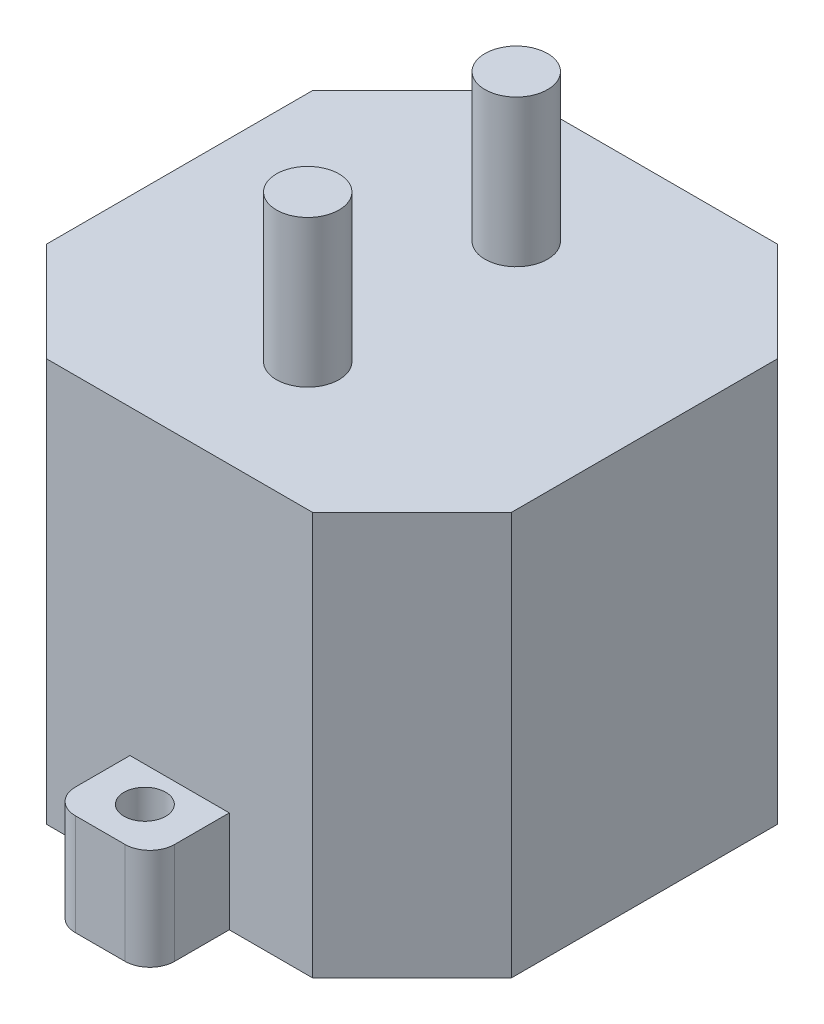
ISO-10303-21;
HEADER;
FILE_DESCRIPTION(('STEP AP214'),'2;1');
FILE_NAME('part.step','',(''),(''),'','','');
FILE_SCHEMA(('AUTOMOTIVE_DESIGN { 1 0 10303 214 1 1 1 1 }'));
ENDSEC;
DATA;
#1=APPLICATION_CONTEXT('core data for automotive mechanical design processes');
#2=APPLICATION_PROTOCOL_DEFINITION('international standard','automotive_design',2000,#1);
#3=PRODUCT_CONTEXT('',#1,'mechanical');
#4=PRODUCT('Part','Part','',(#3));
#5=PRODUCT_RELATED_PRODUCT_CATEGORY('part','',(#4));
#6=PRODUCT_DEFINITION_FORMATION('','',#4);
#7=PRODUCT_DEFINITION_CONTEXT('part definition',#1,'design');
#8=PRODUCT_DEFINITION('design','',#6,#7);
#9=PRODUCT_DEFINITION_SHAPE('','',#8);
#10=(LENGTH_UNIT() NAMED_UNIT(*) SI_UNIT(.MILLI.,.METRE.));
#11=(NAMED_UNIT(*) PLANE_ANGLE_UNIT() SI_UNIT($,.RADIAN.));
#12=(NAMED_UNIT(*) SI_UNIT($,.STERADIAN.) SOLID_ANGLE_UNIT());
#13=UNCERTAINTY_MEASURE_WITH_UNIT(LENGTH_MEASURE(1.E-05),#10,'distance_accuracy_value','');
#14=(GEOMETRIC_REPRESENTATION_CONTEXT(3) GLOBAL_UNCERTAINTY_ASSIGNED_CONTEXT((#13)) GLOBAL_UNIT_ASSIGNED_CONTEXT((#10,
#11,#12)) REPRESENTATION_CONTEXT('',''));
#15=CARTESIAN_POINT('',(0.,0.,0.));
#16=DIRECTION('',(0.,0.,1.));
#17=DIRECTION('',(1.,0.,0.));
#18=AXIS2_PLACEMENT_3D('',#15,#16,#17);
#19=CARTESIAN_POINT('',(29.718,51.562,-76.454));
#20=DIRECTION('',(0.,1.,0.));
#21=DIRECTION('',(0.,0.,1.));
#22=AXIS2_PLACEMENT_3D('',#19,#20,#21);
#23=PLANE('',#22);
#24=CARTESIAN_POINT('',(29.718,51.562,-43.053));
#25=DIRECTION('',(0.,1.,0.));
#26=DIRECTION('',(0.,0.,1.));
#27=AXIS2_PLACEMENT_3D('',#24,#25,#26);
#28=CIRCLE('',#27,4.00000000000001);
#29=CARTESIAN_POINT('',(29.718,51.562,-39.053));
#30=VERTEX_POINT('',#29);
#31=EDGE_CURVE('E759',#30,#30,#28,.T.);
#32=ORIENTED_EDGE('',*,*,#31,.F.);
#33=EDGE_LOOP('',(#32));
#34=FACE_BOUND('',#33,.T.);
#35=DIRECTION('',(-0.707106781186548,0.,-0.707106781186548));
#36=VECTOR('',#35,1.);
#37=CARTESIAN_POINT('',(59.436,51.562,-46.736));
#38=LINE('',#37,#36);
#39=CARTESIAN_POINT('',(59.436,51.562,-46.736));
#40=VERTEX_POINT('',#39);
#41=CARTESIAN_POINT('',(46.736,51.562,-59.436));
#42=VERTEX_POINT('',#41);
#43=EDGE_CURVE('E179',#40,#42,#38,.T.);
#44=ORIENTED_EDGE('',*,*,#43,.T.);
#45=DIRECTION('',(-1.,0.,0.));
#46=VECTOR('',#45,1.);
#47=CARTESIAN_POINT('',(46.736,51.562,-59.436));
#48=LINE('',#47,#46);
#49=CARTESIAN_POINT('',(12.7,51.562,-59.436));
#50=VERTEX_POINT('',#49);
#51=EDGE_CURVE('E189',#42,#50,#48,.T.);
#52=ORIENTED_EDGE('',*,*,#51,.T.);
#53=DIRECTION('',(-0.707106781186547,0.,0.707106781186547));
#54=VECTOR('',#53,1.);
#55=CARTESIAN_POINT('',(12.7,51.562,-59.436));
#56=LINE('',#55,#54);
#57=CARTESIAN_POINT('',(0.,51.562,-46.736));
#58=VERTEX_POINT('',#57);
#59=EDGE_CURVE('E196',#50,#58,#56,.T.);
#60=ORIENTED_EDGE('',*,*,#59,.T.);
#61=DIRECTION('',(0.,0.,1.));
#62=VECTOR('',#61,1.);
#63=CARTESIAN_POINT('',(0.,51.562,-46.736));
#64=LINE('',#63,#62);
#65=CARTESIAN_POINT('',(0.,51.562,-12.7));
#66=VERTEX_POINT('',#65);
#67=EDGE_CURVE('E212',#58,#66,#64,.T.);
#68=ORIENTED_EDGE('',*,*,#67,.T.);
#69=DIRECTION('',(0.707106781186547,0.,0.707106781186547));
#70=VECTOR('',#69,1.);
#71=CARTESIAN_POINT('',(0.,51.562,-12.7));
#72=LINE('',#71,#70);
#73=CARTESIAN_POINT('',(12.7,51.562,0.));
#74=VERTEX_POINT('',#73);
#75=EDGE_CURVE('E215',#66,#74,#72,.T.);
#76=ORIENTED_EDGE('',*,*,#75,.T.);
#77=DIRECTION('',(1.,0.,0.));
#78=VECTOR('',#77,1.);
#79=CARTESIAN_POINT('',(12.7,51.562,0.));
#80=LINE('',#79,#78);
#81=CARTESIAN_POINT('',(46.736,51.562,0.));
#82=VERTEX_POINT('',#81);
#83=EDGE_CURVE('E218',#74,#82,#80,.T.);
#84=ORIENTED_EDGE('',*,*,#83,.T.);
#85=DIRECTION('',(0.707106781186547,0.,-0.707106781186548));
#86=VECTOR('',#85,1.);
#87=CARTESIAN_POINT('',(46.736,51.562,0.));
#88=LINE('',#87,#86);
#89=CARTESIAN_POINT('',(59.436,51.562,-12.7));
#90=VERTEX_POINT('',#89);
#91=EDGE_CURVE('E221',#82,#90,#88,.T.);
#92=ORIENTED_EDGE('',*,*,#91,.T.);
#93=DIRECTION('',(0.,0.,-1.));
#94=VECTOR('',#93,1.);
#95=CARTESIAN_POINT('',(59.436,51.562,-12.7));
#96=LINE('',#95,#94);
#97=EDGE_CURVE('E202',#90,#40,#96,.T.);
#98=ORIENTED_EDGE('',*,*,#97,.T.);
#99=EDGE_LOOP('',(#44,#52,#60,#68,#76,#84,#92,#98));
#100=FACE_BOUND('',#99,.T.);
#101=CARTESIAN_POINT('',(29.718,51.562,-16.383));
#102=DIRECTION('',(0.,1.,0.));
#103=DIRECTION('',(0.,0.,1.));
#104=AXIS2_PLACEMENT_3D('',#101,#102,#103);
#105=CIRCLE('',#104,4.00000000000001);
#106=CARTESIAN_POINT('',(29.718,51.562,-12.383));
#107=VERTEX_POINT('',#106);
#108=EDGE_CURVE('E760',#107,#107,#105,.T.);
#109=ORIENTED_EDGE('',*,*,#108,.F.);
#110=EDGE_LOOP('',(#109));
#111=FACE_BOUND('',#110,.T.);
#112=ADVANCED_FACE('F36',(#34,#100,#111),#23,.T.);
#113=CARTESIAN_POINT('',(-42.3373123737591,12.954,-29.718));
#114=DIRECTION('',(0.,1.,0.));
#115=DIRECTION('',(0.,0.,1.));
#116=AXIS2_PLACEMENT_3D('',#113,#114,#115);
#117=PLANE('',#116);
#118=CARTESIAN_POINT('',(29.718,12.954,4.445));
#119=DIRECTION('',(0.,1.,0.));
#120=DIRECTION('',(0.,0.,1.));
#121=AXIS2_PLACEMENT_3D('',#118,#119,#120);
#122=CIRCLE('',#121,2.66700000000001);
#123=CARTESIAN_POINT('',(29.718,12.954,7.11200000000001));
#124=VERTEX_POINT('',#123);
#125=EDGE_CURVE('E326',#124,#124,#122,.T.);
#126=ORIENTED_EDGE('',*,*,#125,.F.);
#127=EDGE_LOOP('',(#126));
#128=FACE_BOUND('',#127,.T.);
#129=DIRECTION('',(1.,0.,0.));
#130=VECTOR('',#129,1.);
#131=CARTESIAN_POINT('',(-42.3373123737591,12.954,10.16));
#132=LINE('',#131,#130);
#133=CARTESIAN_POINT('',(26.543,12.954,10.16));
#134=VERTEX_POINT('',#133);
#135=CARTESIAN_POINT('',(32.893,12.954,10.16));
#136=VERTEX_POINT('',#135);
#137=EDGE_CURVE('E230',#134,#136,#132,.T.);
#138=ORIENTED_EDGE('',*,*,#137,.T.);
#139=CARTESIAN_POINT('',(32.893,12.954,6.985));
#140=DIRECTION('',(0.,1.,0.));
#141=DIRECTION('',(0.,0.,1.));
#142=AXIS2_PLACEMENT_3D('',#139,#140,#141);
#143=CIRCLE('',#142,3.175);
#144=CARTESIAN_POINT('',(36.068,12.954,6.985));
#145=VERTEX_POINT('',#144);
#146=EDGE_CURVE('E44',#136,#145,#143,.T.);
#147=ORIENTED_EDGE('',*,*,#146,.T.);
#148=DIRECTION('',(0.,0.,1.));
#149=VECTOR('',#148,1.);
#150=CARTESIAN_POINT('',(36.068,12.954,-29.718));
#151=LINE('',#150,#149);
#152=CARTESIAN_POINT('',(36.068,12.954,0.));
#153=VERTEX_POINT('',#152);
#154=EDGE_CURVE('E186',#153,#145,#151,.T.);
#155=ORIENTED_EDGE('',*,*,#154,.F.);
#156=DIRECTION('',(1.,0.,0.));
#157=VECTOR('',#156,1.);
#158=CARTESIAN_POINT('',(36.068,12.954,0.));
#159=LINE('',#158,#157);
#160=CARTESIAN_POINT('',(23.368,12.954,0.));
#161=VERTEX_POINT('',#160);
#162=EDGE_CURVE('E294',#161,#153,#159,.T.);
#163=ORIENTED_EDGE('',*,*,#162,.F.);
#164=DIRECTION('',(0.,0.,1.));
#165=VECTOR('',#164,1.);
#166=CARTESIAN_POINT('',(23.368,12.954,-29.718));
#167=LINE('',#166,#165);
#168=CARTESIAN_POINT('',(23.368,12.954,6.985));
#169=VERTEX_POINT('',#168);
#170=EDGE_CURVE('E232',#161,#169,#167,.T.);
#171=ORIENTED_EDGE('',*,*,#170,.T.);
#172=CARTESIAN_POINT('',(26.543,12.954,6.985));
#173=DIRECTION('',(0.,1.,0.));
#174=DIRECTION('',(0.,0.,1.));
#175=AXIS2_PLACEMENT_3D('',#172,#173,#174);
#176=CIRCLE('',#175,3.175);
#177=EDGE_CURVE('E355',#169,#134,#176,.T.);
#178=ORIENTED_EDGE('',*,*,#177,.T.);
#179=EDGE_LOOP('',(#138,#147,#155,#163,#171,#178));
#180=FACE_BOUND('',#179,.T.);
#181=ADVANCED_FACE('F359',(#128,#180),#117,.T.);
#182=CARTESIAN_POINT('',(36.068,12.954,-29.718));
#183=DIRECTION('',(-1.,0.,0.));
#184=DIRECTION('',(0.,0.,1.));
#185=AXIS2_PLACEMENT_3D('',#182,#183,#184);
#186=PLANE('',#185);
#187=DIRECTION('',(0.,0.,-1.));
#188=VECTOR('',#187,1.);
#189=CARTESIAN_POINT('',(36.068,0.,-29.718));
#190=LINE('',#189,#188);
#191=CARTESIAN_POINT('',(36.068,0.,-59.436));
#192=VERTEX_POINT('',#191);
#193=CARTESIAN_POINT('',(36.068,0.,-66.421));
#194=VERTEX_POINT('',#193);
#195=EDGE_CURVE('E234',#192,#194,#190,.T.);
#196=ORIENTED_EDGE('',*,*,#195,.T.);
#197=DIRECTION('',(0.,-1.,0.));
#198=VECTOR('',#197,1.);
#199=CARTESIAN_POINT('',(36.068,12.954,-66.421));
#200=LINE('',#199,#198);
#201=CARTESIAN_POINT('',(36.068,12.954,-66.421));
#202=VERTEX_POINT('',#201);
#203=EDGE_CURVE('E339',#194,#202,#200,.F.);
#204=ORIENTED_EDGE('',*,*,#203,.T.);
#205=DIRECTION('',(0.,0.,-1.));
#206=VECTOR('',#205,1.);
#207=CARTESIAN_POINT('',(36.068,12.954,-29.718));
#208=LINE('',#207,#206);
#209=CARTESIAN_POINT('',(36.068,12.954,-59.436));
#210=VERTEX_POINT('',#209);
#211=EDGE_CURVE('E229',#210,#202,#208,.T.);
#212=ORIENTED_EDGE('',*,*,#211,.F.);
#213=DIRECTION('',(0.,-1.,0.));
#214=VECTOR('',#213,1.);
#215=CARTESIAN_POINT('',(36.068,12.954,-59.436));
#216=LINE('',#215,#214);
#217=EDGE_CURVE('E315',#210,#192,#216,.T.);
#218=ORIENTED_EDGE('',*,*,#217,.T.);
#219=EDGE_LOOP('',(#196,#204,#212,#218));
#220=FACE_BOUND('',#219,.T.);
#221=ADVANCED_FACE('F415',(#220),#186,.F.);
#222=CARTESIAN_POINT('',(-42.3373123737591,12.954,-69.596));
#223=DIRECTION('',(0.,0.,-1.));
#224=DIRECTION('',(-1.,0.,0.));
#225=AXIS2_PLACEMENT_3D('',#222,#223,#224);
#226=PLANE('',#225);
#227=DIRECTION('',(1.,0.,0.));
#228=VECTOR('',#227,1.);
#229=CARTESIAN_POINT('',(-42.3373123737591,12.954,-69.596));
#230=LINE('',#229,#228);
#231=CARTESIAN_POINT('',(26.543,12.954,-69.596));
#232=VERTEX_POINT('',#231);
#233=CARTESIAN_POINT('',(32.893,12.954,-69.596));
#234=VERTEX_POINT('',#233);
#235=EDGE_CURVE('E225',#232,#234,#230,.T.);
#236=ORIENTED_EDGE('',*,*,#235,.T.);
#237=DIRECTION('',(0.,-1.,0.));
#238=VECTOR('',#237,1.);
#239=CARTESIAN_POINT('',(32.893,0.,-69.596));
#240=LINE('',#239,#238);
#241=CARTESIAN_POINT('',(32.893,0.,-69.596));
#242=VERTEX_POINT('',#241);
#243=EDGE_CURVE('E328',#234,#242,#240,.T.);
#244=ORIENTED_EDGE('',*,*,#243,.T.);
#245=DIRECTION('',(1.,0.,0.));
#246=VECTOR('',#245,1.);
#247=CARTESIAN_POINT('',(-42.3373123737591,0.,-69.596));
#248=LINE('',#247,#246);
#249=CARTESIAN_POINT('',(26.543,0.,-69.596));
#250=VERTEX_POINT('',#249);
#251=EDGE_CURVE('E237',#250,#242,#248,.T.);
#252=ORIENTED_EDGE('',*,*,#251,.F.);
#253=DIRECTION('',(0.,-1.,0.));
#254=VECTOR('',#253,1.);
#255=CARTESIAN_POINT('',(26.543,12.954,-69.596));
#256=LINE('',#255,#254);
#257=EDGE_CURVE('E297',#250,#232,#256,.F.);
#258=ORIENTED_EDGE('',*,*,#257,.T.);
#259=EDGE_LOOP('',(#236,#244,#252,#258));
#260=FACE_BOUND('',#259,.T.);
#261=ADVANCED_FACE('F406',(#260),#226,.T.);
#262=CARTESIAN_POINT('',(23.368,12.954,-29.718));
#263=DIRECTION('',(-1.,0.,0.));
#264=DIRECTION('',(0.,0.,1.));
#265=AXIS2_PLACEMENT_3D('',#262,#263,#264);
#266=PLANE('',#265);
#267=DIRECTION('',(0.,0.,-1.));
#268=VECTOR('',#267,1.);
#269=CARTESIAN_POINT('',(23.368,12.954,-29.718));
#270=LINE('',#269,#268);
#271=CARTESIAN_POINT('',(23.368,12.954,-59.436));
#272=VERTEX_POINT('',#271);
#273=CARTESIAN_POINT('',(23.368,12.954,-66.421));
#274=VERTEX_POINT('',#273);
#275=EDGE_CURVE('E228',#272,#274,#270,.T.);
#276=ORIENTED_EDGE('',*,*,#275,.T.);
#277=DIRECTION('',(0.,-1.,0.));
#278=VECTOR('',#277,1.);
#279=CARTESIAN_POINT('',(23.368,12.954,-66.421));
#280=LINE('',#279,#278);
#281=CARTESIAN_POINT('',(23.368,0.,-66.421));
#282=VERTEX_POINT('',#281);
#283=EDGE_CURVE('E345',#274,#282,#280,.T.);
#284=ORIENTED_EDGE('',*,*,#283,.T.);
#285=DIRECTION('',(0.,0.,-1.));
#286=VECTOR('',#285,1.);
#287=CARTESIAN_POINT('',(23.368,0.,-29.718));
#288=LINE('',#287,#286);
#289=CARTESIAN_POINT('',(23.368,0.,-59.436));
#290=VERTEX_POINT('',#289);
#291=EDGE_CURVE('E240',#290,#282,#288,.T.);
#292=ORIENTED_EDGE('',*,*,#291,.F.);
#293=DIRECTION('',(0.,-1.,0.));
#294=VECTOR('',#293,1.);
#295=CARTESIAN_POINT('',(23.368,12.954,-59.436));
#296=LINE('',#295,#294);
#297=EDGE_CURVE('E288',#272,#290,#296,.T.);
#298=ORIENTED_EDGE('',*,*,#297,.F.);
#299=EDGE_LOOP('',(#276,#284,#292,#298));
#300=FACE_BOUND('',#299,.T.);
#301=ADVANCED_FACE('F398',(#300),#266,.T.);
#302=CARTESIAN_POINT('',(-42.3373123737591,12.954,-59.436));
#303=DIRECTION('',(0.,0.,-1.));
#304=DIRECTION('',(-1.,0.,0.));
#305=AXIS2_PLACEMENT_3D('',#302,#303,#304);
#306=PLANE('',#305);
#307=DIRECTION('',(1.,0.,0.));
#308=VECTOR('',#307,1.);
#309=CARTESIAN_POINT('',(-42.3373123737591,0.,-59.436));
#310=LINE('',#309,#308);
#311=CARTESIAN_POINT('',(12.7,0.,-59.436));
#312=VERTEX_POINT('',#311);
#313=EDGE_CURVE('E243',#312,#290,#310,.T.);
#314=ORIENTED_EDGE('',*,*,#313,.F.);
#315=DIRECTION('',(0.,-1.,0.));
#316=VECTOR('',#315,1.);
#317=CARTESIAN_POINT('',(12.7,12.954,-59.436));
#318=LINE('',#317,#316);
#319=EDGE_CURVE('E192',#50,#312,#318,.T.);
#320=ORIENTED_EDGE('',*,*,#319,.F.);
#321=ORIENTED_EDGE('',*,*,#51,.F.);
#322=DIRECTION('',(0.,-1.,0.));
#323=VECTOR('',#322,1.);
#324=CARTESIAN_POINT('',(46.736,12.954,-59.436));
#325=LINE('',#324,#323);
#326=CARTESIAN_POINT('',(46.736,0.,-59.436));
#327=VERTEX_POINT('',#326);
#328=EDGE_CURVE('E175',#42,#327,#325,.T.);
#329=ORIENTED_EDGE('',*,*,#328,.T.);
#330=DIRECTION('',(1.,0.,0.));
#331=VECTOR('',#330,1.);
#332=CARTESIAN_POINT('',(-42.3373123737591,0.,-59.436));
#333=LINE('',#332,#331);
#334=EDGE_CURVE('E224',#192,#327,#333,.T.);
#335=ORIENTED_EDGE('',*,*,#334,.F.);
#336=ORIENTED_EDGE('',*,*,#217,.F.);
#337=DIRECTION('',(-1.,0.,0.));
#338=VECTOR('',#337,1.);
#339=CARTESIAN_POINT('',(23.368,12.954,-59.436));
#340=LINE('',#339,#338);
#341=EDGE_CURVE('E298',#210,#272,#340,.T.);
#342=ORIENTED_EDGE('',*,*,#341,.T.);
#343=ORIENTED_EDGE('',*,*,#297,.T.);
#344=EDGE_LOOP('',(#314,#320,#321,#329,#335,#336,#342,#343));
#345=FACE_BOUND('',#344,.T.);
#346=ADVANCED_FACE('F191',(#345),#306,.T.);
#347=CARTESIAN_POINT('',(-29.6776561868795,12.954,-17.0583438131204));
#348=DIRECTION('',(-0.707106781186548,0.,-0.707106781186548));
#349=DIRECTION('',(-0.707106781186548,0.,0.707106781186548));
#350=AXIS2_PLACEMENT_3D('',#347,#348,#349);
#351=PLANE('',#350);
#352=DIRECTION('',(0.707106781186547,0.,-0.707106781186548));
#353=VECTOR('',#352,1.);
#354=CARTESIAN_POINT('',(-29.6776561868795,0.,-17.0583438131204));
#355=LINE('',#354,#353);
#356=CARTESIAN_POINT('',(0.,0.,-46.736));
#357=VERTEX_POINT('',#356);
#358=EDGE_CURVE('E246',#357,#312,#355,.T.);
#359=ORIENTED_EDGE('',*,*,#358,.F.);
#360=DIRECTION('',(0.,-1.,0.));
#361=VECTOR('',#360,1.);
#362=CARTESIAN_POINT('',(0.,12.954,-46.736));
#363=LINE('',#362,#361);
#364=EDGE_CURVE('E285',#58,#357,#363,.T.);
#365=ORIENTED_EDGE('',*,*,#364,.F.);
#366=ORIENTED_EDGE('',*,*,#59,.F.);
#367=ORIENTED_EDGE('',*,*,#319,.T.);
#368=EDGE_LOOP('',(#359,#365,#366,#367));
#369=FACE_BOUND('',#368,.T.);
#370=ADVANCED_FACE('F390',(#369),#351,.T.);
#371=CARTESIAN_POINT('',(0.,12.954,-29.718));
#372=DIRECTION('',(-1.,0.,0.));
#373=DIRECTION('',(0.,0.,1.));
#374=AXIS2_PLACEMENT_3D('',#371,#372,#373);
#375=PLANE('',#374);
#376=DIRECTION('',(0.,0.,-1.));
#377=VECTOR('',#376,1.);
#378=CARTESIAN_POINT('',(0.,0.,-29.718));
#379=LINE('',#378,#377);
#380=CARTESIAN_POINT('',(0.,0.,-12.7));
#381=VERTEX_POINT('',#380);
#382=EDGE_CURVE('E249',#381,#357,#379,.T.);
#383=ORIENTED_EDGE('',*,*,#382,.F.);
#384=DIRECTION('',(0.,-1.,0.));
#385=VECTOR('',#384,1.);
#386=CARTESIAN_POINT('',(0.,12.954,-12.7));
#387=LINE('',#386,#385);
#388=EDGE_CURVE('E282',#66,#381,#387,.T.);
#389=ORIENTED_EDGE('',*,*,#388,.F.);
#390=ORIENTED_EDGE('',*,*,#67,.F.);
#391=ORIENTED_EDGE('',*,*,#364,.T.);
#392=EDGE_LOOP('',(#383,#389,#390,#391));
#393=FACE_BOUND('',#392,.T.);
#394=ADVANCED_FACE('F386',(#393),#375,.T.);
#395=CARTESIAN_POINT('',(-29.6776561868795,12.954,-42.3776561868795));
#396=DIRECTION('',(0.707106781186548,0.,-0.707106781186548));
#397=DIRECTION('',(-0.707106781186548,0.,-0.707106781186548));
#398=AXIS2_PLACEMENT_3D('',#395,#396,#397);
#399=PLANE('',#398);
#400=DIRECTION('',(0.707106781186548,0.,0.707106781186548));
#401=VECTOR('',#400,1.);
#402=CARTESIAN_POINT('',(-29.6776561868795,0.,-42.3776561868795));
#403=LINE('',#402,#401);
#404=CARTESIAN_POINT('',(12.7,0.,0.));
#405=VERTEX_POINT('',#404);
#406=EDGE_CURVE('E252',#381,#405,#403,.T.);
#407=ORIENTED_EDGE('',*,*,#406,.T.);
#408=DIRECTION('',(0.,-1.,0.));
#409=VECTOR('',#408,1.);
#410=CARTESIAN_POINT('',(12.7,12.954,0.));
#411=LINE('',#410,#409);
#412=EDGE_CURVE('E279',#74,#405,#411,.T.);
#413=ORIENTED_EDGE('',*,*,#412,.F.);
#414=ORIENTED_EDGE('',*,*,#75,.F.);
#415=ORIENTED_EDGE('',*,*,#388,.T.);
#416=EDGE_LOOP('',(#407,#413,#414,#415));
#417=FACE_BOUND('',#416,.T.);
#418=ADVANCED_FACE('F425',(#417),#399,.F.);
#419=CARTESIAN_POINT('',(23.368,12.954,-29.718));
#420=DIRECTION('',(1.,0.,0.));
#421=DIRECTION('',(0.,0.,-1.));
#422=AXIS2_PLACEMENT_3D('',#419,#420,#421);
#423=PLANE('',#422);
#424=DIRECTION('',(0.,0.,1.));
#425=VECTOR('',#424,1.);
#426=CARTESIAN_POINT('',(23.368,0.,-29.718));
#427=LINE('',#426,#425);
#428=CARTESIAN_POINT('',(23.368,0.,0.));
#429=VERTEX_POINT('',#428);
#430=CARTESIAN_POINT('',(23.368,0.,6.985));
#431=VERTEX_POINT('',#430);
#432=EDGE_CURVE('E256',#429,#431,#427,.T.);
#433=ORIENTED_EDGE('',*,*,#432,.T.);
#434=DIRECTION('',(0.,-1.,0.));
#435=VECTOR('',#434,1.);
#436=CARTESIAN_POINT('',(23.368,12.954,6.985));
#437=LINE('',#436,#435);
#438=EDGE_CURVE('E11',#431,#169,#437,.F.);
#439=ORIENTED_EDGE('',*,*,#438,.T.);
#440=ORIENTED_EDGE('',*,*,#170,.F.);
#441=DIRECTION('',(0.,-1.,0.));
#442=VECTOR('',#441,1.);
#443=CARTESIAN_POINT('',(23.368,12.954,0.));
#444=LINE('',#443,#442);
#445=EDGE_CURVE('E283',#161,#429,#444,.T.);
#446=ORIENTED_EDGE('',*,*,#445,.T.);
#447=EDGE_LOOP('',(#433,#439,#440,#446));
#448=FACE_BOUND('',#447,.T.);
#449=ADVANCED_FACE('F377',(#448),#423,.F.);
#450=CARTESIAN_POINT('',(-42.3373123737591,12.954,10.16));
#451=DIRECTION('',(0.,0.,-1.));
#452=DIRECTION('',(-1.,0.,0.));
#453=AXIS2_PLACEMENT_3D('',#450,#451,#452);
#454=PLANE('',#453);
#455=DIRECTION('',(1.,0.,0.));
#456=VECTOR('',#455,1.);
#457=CARTESIAN_POINT('',(-42.3373123737591,0.,10.16));
#458=LINE('',#457,#456);
#459=CARTESIAN_POINT('',(26.543,0.,10.16));
#460=VERTEX_POINT('',#459);
#461=CARTESIAN_POINT('',(32.893,0.,10.16));
#462=VERTEX_POINT('',#461);
#463=EDGE_CURVE('E258',#460,#462,#458,.T.);
#464=ORIENTED_EDGE('',*,*,#463,.T.);
#465=DIRECTION('',(0.,-1.,0.));
#466=VECTOR('',#465,1.);
#467=CARTESIAN_POINT('',(32.893,12.954,10.16));
#468=LINE('',#467,#466);
#469=EDGE_CURVE('E57',#462,#136,#468,.F.);
#470=ORIENTED_EDGE('',*,*,#469,.T.);
#471=ORIENTED_EDGE('',*,*,#137,.F.);
#472=DIRECTION('',(0.,-1.,0.));
#473=VECTOR('',#472,1.);
#474=CARTESIAN_POINT('',(26.543,12.954,10.16));
#475=LINE('',#474,#473);
#476=EDGE_CURVE('E351',#134,#460,#475,.T.);
#477=ORIENTED_EDGE('',*,*,#476,.T.);
#478=EDGE_LOOP('',(#464,#470,#471,#477));
#479=FACE_BOUND('',#478,.T.);
#480=ADVANCED_FACE('F371',(#479),#454,.F.);
#481=CARTESIAN_POINT('',(36.068,12.954,-29.718));
#482=DIRECTION('',(1.,0.,0.));
#483=DIRECTION('',(0.,0.,-1.));
#484=AXIS2_PLACEMENT_3D('',#481,#482,#483);
#485=PLANE('',#484);
#486=ORIENTED_EDGE('',*,*,#154,.T.);
#487=DIRECTION('',(0.,-1.,0.));
#488=VECTOR('',#487,1.);
#489=CARTESIAN_POINT('',(36.068,0.,6.985));
#490=LINE('',#489,#488);
#491=CARTESIAN_POINT('',(36.068,0.,6.985));
#492=VERTEX_POINT('',#491);
#493=EDGE_CURVE('E348',#145,#492,#490,.T.);
#494=ORIENTED_EDGE('',*,*,#493,.T.);
#495=DIRECTION('',(0.,0.,1.));
#496=VECTOR('',#495,1.);
#497=CARTESIAN_POINT('',(36.068,0.,-29.718));
#498=LINE('',#497,#496);
#499=CARTESIAN_POINT('',(36.068,0.,0.));
#500=VERTEX_POINT('',#499);
#501=EDGE_CURVE('E260',#500,#492,#498,.T.);
#502=ORIENTED_EDGE('',*,*,#501,.F.);
#503=DIRECTION('',(0.,-1.,0.));
#504=VECTOR('',#503,1.);
#505=CARTESIAN_POINT('',(36.068,12.954,0.));
#506=LINE('',#505,#504);
#507=EDGE_CURVE('E278',#153,#500,#506,.T.);
#508=ORIENTED_EDGE('',*,*,#507,.F.);
#509=EDGE_LOOP('',(#486,#494,#502,#508));
#510=FACE_BOUND('',#509,.T.);
#511=ADVANCED_FACE('F364',(#510),#485,.T.);
#512=CARTESIAN_POINT('',(-42.3373123737591,12.954,0.));
#513=DIRECTION('',(0.,0.,-1.));
#514=DIRECTION('',(-1.,0.,0.));
#515=AXIS2_PLACEMENT_3D('',#512,#513,#514);
#516=PLANE('',#515);
#517=DIRECTION('',(1.,0.,0.));
#518=VECTOR('',#517,1.);
#519=CARTESIAN_POINT('',(-42.3373123737591,0.,0.));
#520=LINE('',#519,#518);
#521=CARTESIAN_POINT('',(46.736,0.,0.));
#522=VERTEX_POINT('',#521);
#523=EDGE_CURVE('E263',#500,#522,#520,.T.);
#524=ORIENTED_EDGE('',*,*,#523,.T.);
#525=DIRECTION('',(0.,-1.,0.));
#526=VECTOR('',#525,1.);
#527=CARTESIAN_POINT('',(46.736,12.954,0.));
#528=LINE('',#527,#526);
#529=EDGE_CURVE('E275',#82,#522,#528,.T.);
#530=ORIENTED_EDGE('',*,*,#529,.F.);
#531=ORIENTED_EDGE('',*,*,#83,.F.);
#532=ORIENTED_EDGE('',*,*,#412,.T.);
#533=DIRECTION('',(1.,0.,0.));
#534=VECTOR('',#533,1.);
#535=CARTESIAN_POINT('',(-42.3373123737591,0.,0.));
#536=LINE('',#535,#534);
#537=EDGE_CURVE('E254',#405,#429,#536,.T.);
#538=ORIENTED_EDGE('',*,*,#537,.T.);
#539=ORIENTED_EDGE('',*,*,#445,.F.);
#540=ORIENTED_EDGE('',*,*,#162,.T.);
#541=ORIENTED_EDGE('',*,*,#507,.T.);
#542=EDGE_LOOP('',(#524,#530,#531,#532,#538,#539,#540,#541));
#543=FACE_BOUND('',#542,.T.);
#544=ADVANCED_FACE('F380',(#543),#516,.F.);
#545=CARTESIAN_POINT('',(17.0583438131205,12.954,29.6776561868795));
#546=DIRECTION('',(-0.707106781186548,0.,-0.707106781186548));
#547=DIRECTION('',(-0.707106781186547,0.,0.707106781186548));
#548=AXIS2_PLACEMENT_3D('',#545,#546,#547);
#549=PLANE('',#548);
#550=DIRECTION('',(0.707106781186547,0.,-0.707106781186548));
#551=VECTOR('',#550,1.);
#552=CARTESIAN_POINT('',(17.0583438131205,0.,29.6776561868795));
#553=LINE('',#552,#551);
#554=CARTESIAN_POINT('',(59.436,0.,-12.7));
#555=VERTEX_POINT('',#554);
#556=EDGE_CURVE('E265',#522,#555,#553,.T.);
#557=ORIENTED_EDGE('',*,*,#556,.T.);
#558=DIRECTION('',(0.,-1.,0.));
#559=VECTOR('',#558,1.);
#560=CARTESIAN_POINT('',(59.436,12.954,-12.7));
#561=LINE('',#560,#559);
#562=EDGE_CURVE('E272',#90,#555,#561,.T.);
#563=ORIENTED_EDGE('',*,*,#562,.F.);
#564=ORIENTED_EDGE('',*,*,#91,.F.);
#565=ORIENTED_EDGE('',*,*,#529,.T.);
#566=EDGE_LOOP('',(#557,#563,#564,#565));
#567=FACE_BOUND('',#566,.T.);
#568=ADVANCED_FACE('F423',(#567),#549,.F.);
#569=CARTESIAN_POINT('',(59.436,12.954,-29.718));
#570=DIRECTION('',(-1.,0.,0.));
#571=DIRECTION('',(0.,0.,1.));
#572=AXIS2_PLACEMENT_3D('',#569,#570,#571);
#573=PLANE('',#572);
#574=DIRECTION('',(0.,0.,-1.));
#575=VECTOR('',#574,1.);
#576=CARTESIAN_POINT('',(59.436,0.,-29.718));
#577=LINE('',#576,#575);
#578=CARTESIAN_POINT('',(59.436,0.,-46.736));
#579=VERTEX_POINT('',#578);
#580=EDGE_CURVE('E267',#555,#579,#577,.T.);
#581=ORIENTED_EDGE('',*,*,#580,.T.);
#582=DIRECTION('',(0.,-1.,0.));
#583=VECTOR('',#582,1.);
#584=CARTESIAN_POINT('',(59.436,12.954,-46.736));
#585=LINE('',#584,#583);
#586=EDGE_CURVE('E185',#40,#579,#585,.T.);
#587=ORIENTED_EDGE('',*,*,#586,.F.);
#588=ORIENTED_EDGE('',*,*,#97,.F.);
#589=ORIENTED_EDGE('',*,*,#562,.T.);
#590=EDGE_LOOP('',(#581,#587,#588,#589));
#591=FACE_BOUND('',#590,.T.);
#592=ADVANCED_FACE('F420',(#591),#573,.F.);
#593=CARTESIAN_POINT('',(17.0583438131205,12.954,-89.1136561868796));
#594=DIRECTION('',(0.707106781186548,0.,-0.707106781186548));
#595=DIRECTION('',(-0.707106781186548,0.,-0.707106781186548));
#596=AXIS2_PLACEMENT_3D('',#593,#594,#595);
#597=PLANE('',#596);
#598=DIRECTION('',(0.707106781186548,0.,0.707106781186548));
#599=VECTOR('',#598,1.);
#600=CARTESIAN_POINT('',(17.0583438131205,0.,-89.1136561868796));
#601=LINE('',#600,#599);
#602=EDGE_CURVE('E181',#327,#579,#601,.T.);
#603=ORIENTED_EDGE('',*,*,#602,.F.);
#604=ORIENTED_EDGE('',*,*,#328,.F.);
#605=ORIENTED_EDGE('',*,*,#43,.F.);
#606=ORIENTED_EDGE('',*,*,#586,.T.);
#607=EDGE_LOOP('',(#603,#604,#605,#606));
#608=FACE_BOUND('',#607,.T.);
#609=ADVANCED_FACE('F177',(#608),#597,.T.);
#610=CARTESIAN_POINT('',(29.718,12.954,-63.881));
#611=DIRECTION('',(0.,1.,0.));
#612=DIRECTION('',(0.,0.,1.));
#613=AXIS2_PLACEMENT_3D('',#610,#611,#612);
#614=CIRCLE('',#613,2.667);
#615=CARTESIAN_POINT('',(29.718,12.954,-61.214));
#616=VERTEX_POINT('',#615);
#617=EDGE_CURVE('E206',#616,#616,#614,.T.);
#618=ORIENTED_EDGE('',*,*,#617,.F.);
#619=EDGE_LOOP('',(#618));
#620=FACE_BOUND('',#619,.T.);
#621=ORIENTED_EDGE('',*,*,#211,.T.);
#622=CARTESIAN_POINT('',(32.893,12.954,-66.421));
#623=DIRECTION('',(0.,1.,0.));
#624=DIRECTION('',(0.,0.,1.));
#625=AXIS2_PLACEMENT_3D('',#622,#623,#624);
#626=CIRCLE('',#625,3.175);
#627=EDGE_CURVE('E343',#202,#234,#626,.T.);
#628=ORIENTED_EDGE('',*,*,#627,.T.);
#629=ORIENTED_EDGE('',*,*,#235,.F.);
#630=CARTESIAN_POINT('',(26.543,12.954,-66.421));
#631=DIRECTION('',(0.,1.,0.));
#632=DIRECTION('',(0.,0.,1.));
#633=AXIS2_PLACEMENT_3D('',#630,#631,#632);
#634=CIRCLE('',#633,3.175);
#635=EDGE_CURVE('E341',#232,#274,#634,.T.);
#636=ORIENTED_EDGE('',*,*,#635,.T.);
#637=ORIENTED_EDGE('',*,*,#275,.F.);
#638=ORIENTED_EDGE('',*,*,#341,.F.);
#639=EDGE_LOOP('',(#621,#628,#629,#636,#637,#638));
#640=FACE_BOUND('',#639,.T.);
#641=ADVANCED_FACE('F442',(#620,#640),#117,.T.);
#642=CARTESIAN_POINT('',(-42.3373123737591,0.,-29.718));
#643=DIRECTION('',(0.,1.,0.));
#644=DIRECTION('',(0.,0.,1.));
#645=AXIS2_PLACEMENT_3D('',#642,#643,#644);
#646=PLANE('',#645);
#647=CARTESIAN_POINT('',(29.718,0.,4.445));
#648=DIRECTION('',(0.,1.,0.));
#649=DIRECTION('',(0.,0.,1.));
#650=AXIS2_PLACEMENT_3D('',#647,#648,#649);
#651=CIRCLE('',#650,2.66700000000001);
#652=CARTESIAN_POINT('',(29.718,0.,7.11200000000001));
#653=VERTEX_POINT('',#652);
#654=EDGE_CURVE('E323',#653,#653,#651,.T.);
#655=ORIENTED_EDGE('',*,*,#654,.T.);
#656=EDGE_LOOP('',(#655));
#657=FACE_BOUND('',#656,.T.);
#658=CARTESIAN_POINT('',(29.718,0.,-63.881));
#659=DIRECTION('',(0.,1.,0.));
#660=DIRECTION('',(0.,0.,1.));
#661=AXIS2_PLACEMENT_3D('',#658,#659,#660);
#662=CIRCLE('',#661,2.667);
#663=CARTESIAN_POINT('',(29.718,0.,-61.214));
#664=VERTEX_POINT('',#663);
#665=EDGE_CURVE('E203',#664,#664,#662,.T.);
#666=ORIENTED_EDGE('',*,*,#665,.T.);
#667=EDGE_LOOP('',(#666));
#668=FACE_BOUND('',#667,.T.);
#669=ORIENTED_EDGE('',*,*,#251,.T.);
#670=CARTESIAN_POINT('',(32.893,0.,-66.421));
#671=DIRECTION('',(0.,1.,0.));
#672=DIRECTION('',(0.,0.,1.));
#673=AXIS2_PLACEMENT_3D('',#670,#671,#672);
#674=CIRCLE('',#673,3.175);
#675=EDGE_CURVE('E337',#242,#194,#674,.F.);
#676=ORIENTED_EDGE('',*,*,#675,.T.);
#677=ORIENTED_EDGE('',*,*,#195,.F.);
#678=ORIENTED_EDGE('',*,*,#334,.T.);
#679=ORIENTED_EDGE('',*,*,#602,.T.);
#680=ORIENTED_EDGE('',*,*,#580,.F.);
#681=ORIENTED_EDGE('',*,*,#556,.F.);
#682=ORIENTED_EDGE('',*,*,#523,.F.);
#683=ORIENTED_EDGE('',*,*,#501,.T.);
#684=CARTESIAN_POINT('',(32.893,0.,6.985));
#685=DIRECTION('',(0.,1.,0.));
#686=DIRECTION('',(0.,0.,1.));
#687=AXIS2_PLACEMENT_3D('',#684,#685,#686);
#688=CIRCLE('',#687,3.175);
#689=EDGE_CURVE('E333',#492,#462,#688,.F.);
#690=ORIENTED_EDGE('',*,*,#689,.T.);
#691=ORIENTED_EDGE('',*,*,#463,.F.);
#692=CARTESIAN_POINT('',(26.543,0.,6.985));
#693=DIRECTION('',(0.,1.,0.));
#694=DIRECTION('',(0.,0.,1.));
#695=AXIS2_PLACEMENT_3D('',#692,#693,#694);
#696=CIRCLE('',#695,3.175);
#697=EDGE_CURVE('E331',#460,#431,#696,.F.);
#698=ORIENTED_EDGE('',*,*,#697,.T.);
#699=ORIENTED_EDGE('',*,*,#432,.F.);
#700=ORIENTED_EDGE('',*,*,#537,.F.);
#701=ORIENTED_EDGE('',*,*,#406,.F.);
#702=ORIENTED_EDGE('',*,*,#382,.T.);
#703=ORIENTED_EDGE('',*,*,#358,.T.);
#704=ORIENTED_EDGE('',*,*,#313,.T.);
#705=ORIENTED_EDGE('',*,*,#291,.T.);
#706=CARTESIAN_POINT('',(26.543,0.,-66.421));
#707=DIRECTION('',(0.,1.,0.));
#708=DIRECTION('',(0.,0.,1.));
#709=AXIS2_PLACEMENT_3D('',#706,#707,#708);
#710=CIRCLE('',#709,3.175);
#711=EDGE_CURVE('E335',#282,#250,#710,.F.);
#712=ORIENTED_EDGE('',*,*,#711,.T.);
#713=EDGE_LOOP('',(#669,#676,#677,#678,#679,#680,#681,#682,#683,#690,#691,#698,#699,#700,#701,
#702,#703,#704,#705,#712));
#714=FACE_BOUND('',#713,.T.);
#715=ADVANCED_FACE('F369',(#657,#668,#714),#646,.F.);
#716=CARTESIAN_POINT('',(29.718,-2.50000000007189E-05,-63.881));
#717=DIRECTION('',(0.,1.,0.));
#718=DIRECTION('',(0.,0.,1.));
#719=AXIS2_PLACEMENT_3D('',#716,#717,#718);
#720=CYLINDRICAL_SURFACE('',#719,2.667);
#721=ORIENTED_EDGE('',*,*,#617,.T.);
#722=EDGE_LOOP('',(#721));
#723=FACE_BOUND('',#722,.T.);
#724=ORIENTED_EDGE('',*,*,#665,.F.);
#725=EDGE_LOOP('',(#724));
#726=FACE_BOUND('',#725,.T.);
#727=ADVANCED_FACE('F445',(#723,#726),#720,.F.);
#728=CARTESIAN_POINT('',(29.718,-2.50000000007189E-05,4.445));
#729=DIRECTION('',(0.,1.,0.));
#730=DIRECTION('',(0.,0.,1.));
#731=AXIS2_PLACEMENT_3D('',#728,#729,#730);
#732=CYLINDRICAL_SURFACE('',#731,2.66700000000001);
#733=ORIENTED_EDGE('',*,*,#125,.T.);
#734=EDGE_LOOP('',(#733));
#735=FACE_BOUND('',#734,.T.);
#736=ORIENTED_EDGE('',*,*,#654,.F.);
#737=EDGE_LOOP('',(#736));
#738=FACE_BOUND('',#737,.T.);
#739=ADVANCED_FACE('F503',(#735,#738),#732,.F.);
#740=CARTESIAN_POINT('',(32.893,12.954,-66.421));
#741=DIRECTION('',(0.,1.,0.));
#742=DIRECTION('',(0.,0.,1.));
#743=AXIS2_PLACEMENT_3D('',#740,#741,#742);
#744=CYLINDRICAL_SURFACE('',#743,3.175);
#745=ORIENTED_EDGE('',*,*,#627,.F.);
#746=ORIENTED_EDGE('',*,*,#203,.F.);
#747=ORIENTED_EDGE('',*,*,#675,.F.);
#748=ORIENTED_EDGE('',*,*,#243,.F.);
#749=EDGE_LOOP('',(#745,#746,#747,#748));
#750=FACE_BOUND('',#749,.T.);
#751=ADVANCED_FACE('F411',(#750),#744,.T.);
#752=CARTESIAN_POINT('',(26.543,12.954,-66.421));
#753=DIRECTION('',(0.,-1.,0.));
#754=DIRECTION('',(0.,0.,-1.));
#755=AXIS2_PLACEMENT_3D('',#752,#753,#754);
#756=CYLINDRICAL_SURFACE('',#755,3.175);
#757=ORIENTED_EDGE('',*,*,#635,.F.);
#758=ORIENTED_EDGE('',*,*,#257,.F.);
#759=ORIENTED_EDGE('',*,*,#711,.F.);
#760=ORIENTED_EDGE('',*,*,#283,.F.);
#761=EDGE_LOOP('',(#757,#758,#759,#760));
#762=FACE_BOUND('',#761,.T.);
#763=ADVANCED_FACE('F402',(#762),#756,.T.);
#764=CARTESIAN_POINT('',(32.893,12.954,6.985));
#765=DIRECTION('',(0.,1.,0.));
#766=DIRECTION('',(0.,0.,1.));
#767=AXIS2_PLACEMENT_3D('',#764,#765,#766);
#768=CYLINDRICAL_SURFACE('',#767,3.175);
#769=ORIENTED_EDGE('',*,*,#146,.F.);
#770=ORIENTED_EDGE('',*,*,#469,.F.);
#771=ORIENTED_EDGE('',*,*,#689,.F.);
#772=ORIENTED_EDGE('',*,*,#493,.F.);
#773=EDGE_LOOP('',(#769,#770,#771,#772));
#774=FACE_BOUND('',#773,.T.);
#775=ADVANCED_FACE('F366',(#774),#768,.T.);
#776=CARTESIAN_POINT('',(26.543,12.954,6.985));
#777=DIRECTION('',(0.,-1.,0.));
#778=DIRECTION('',(0.,0.,-1.));
#779=AXIS2_PLACEMENT_3D('',#776,#777,#778);
#780=CYLINDRICAL_SURFACE('',#779,3.175);
#781=ORIENTED_EDGE('',*,*,#177,.F.);
#782=ORIENTED_EDGE('',*,*,#438,.F.);
#783=ORIENTED_EDGE('',*,*,#697,.F.);
#784=ORIENTED_EDGE('',*,*,#476,.F.);
#785=EDGE_LOOP('',(#781,#782,#783,#784));
#786=FACE_BOUND('',#785,.T.);
#787=ADVANCED_FACE('F38',(#786),#780,.T.);
#788=CARTESIAN_POINT('',(29.718,70.358,-43.053));
#789=DIRECTION('',(0.,-1.,0.));
#790=DIRECTION('',(0.,0.,-1.));
#791=AXIS2_PLACEMENT_3D('',#788,#789,#790);
#792=CYLINDRICAL_SURFACE('',#791,4.00000000000001);
#793=CARTESIAN_POINT('',(29.718,70.358,-43.053));
#794=DIRECTION('',(0.,1.,0.));
#795=DIRECTION('',(0.,0.,1.));
#796=AXIS2_PLACEMENT_3D('',#793,#794,#795);
#797=CIRCLE('',#796,4.00000000000001);
#798=CARTESIAN_POINT('',(29.718,70.358,-39.053));
#799=VERTEX_POINT('',#798);
#800=EDGE_CURVE('E763',#799,#799,#797,.T.);
#801=ORIENTED_EDGE('',*,*,#800,.F.);
#802=EDGE_LOOP('',(#801));
#803=FACE_BOUND('',#802,.T.);
#804=ORIENTED_EDGE('',*,*,#31,.T.);
#805=EDGE_LOOP('',(#804));
#806=FACE_BOUND('',#805,.T.);
#807=ADVANCED_FACE('F533',(#803,#806),#792,.T.);
#808=CARTESIAN_POINT('',(29.718,70.358,-43.053));
#809=DIRECTION('',(0.,1.,0.));
#810=DIRECTION('',(0.,0.,1.));
#811=AXIS2_PLACEMENT_3D('',#808,#809,#810);
#812=PLANE('',#811);
#813=ORIENTED_EDGE('',*,*,#800,.T.);
#814=EDGE_LOOP('',(#813));
#815=FACE_BOUND('',#814,.T.);
#816=ADVANCED_FACE('F540',(#815),#812,.T.);
#817=CARTESIAN_POINT('',(29.718,70.358,-16.383));
#818=DIRECTION('',(0.,-1.,0.));
#819=DIRECTION('',(0.,0.,-1.));
#820=AXIS2_PLACEMENT_3D('',#817,#818,#819);
#821=CYLINDRICAL_SURFACE('',#820,4.00000000000001);
#822=CARTESIAN_POINT('',(29.718,70.358,-16.383));
#823=DIRECTION('',(0.,1.,0.));
#824=DIRECTION('',(0.,0.,1.));
#825=AXIS2_PLACEMENT_3D('',#822,#823,#824);
#826=CIRCLE('',#825,4.00000000000001);
#827=CARTESIAN_POINT('',(29.718,70.358,-12.383));
#828=VERTEX_POINT('',#827);
#829=EDGE_CURVE('E758',#828,#828,#826,.T.);
#830=ORIENTED_EDGE('',*,*,#829,.F.);
#831=EDGE_LOOP('',(#830));
#832=FACE_BOUND('',#831,.T.);
#833=ORIENTED_EDGE('',*,*,#108,.T.);
#834=EDGE_LOOP('',(#833));
#835=FACE_BOUND('',#834,.T.);
#836=ADVANCED_FACE('F549',(#832,#835),#821,.T.);
#837=CARTESIAN_POINT('',(29.718,70.358,-16.383));
#838=DIRECTION('',(0.,1.,0.));
#839=DIRECTION('',(0.,0.,1.));
#840=AXIS2_PLACEMENT_3D('',#837,#838,#839);
#841=PLANE('',#840);
#842=ORIENTED_EDGE('',*,*,#829,.T.);
#843=EDGE_LOOP('',(#842));
#844=FACE_BOUND('',#843,.T.);
#845=ADVANCED_FACE('F557',(#844),#841,.T.);
#846=CLOSED_SHELL('',(#112,#181,#221,#261,#301,#346,#370,#394,#418,#449,#480,#511,#544,#568,
#592,#609,#641,#715,#727,#739,#751,#763,#775,#787,#807,#816,#836,#845));
#847=MANIFOLD_SOLID_BREP('B2',#846);
#848=ADVANCED_BREP_SHAPE_REPRESENTATION('',(#18,#847),#14);
#849=SHAPE_DEFINITION_REPRESENTATION(#9,#848);
ENDSEC;
END-ISO-10303-21;
